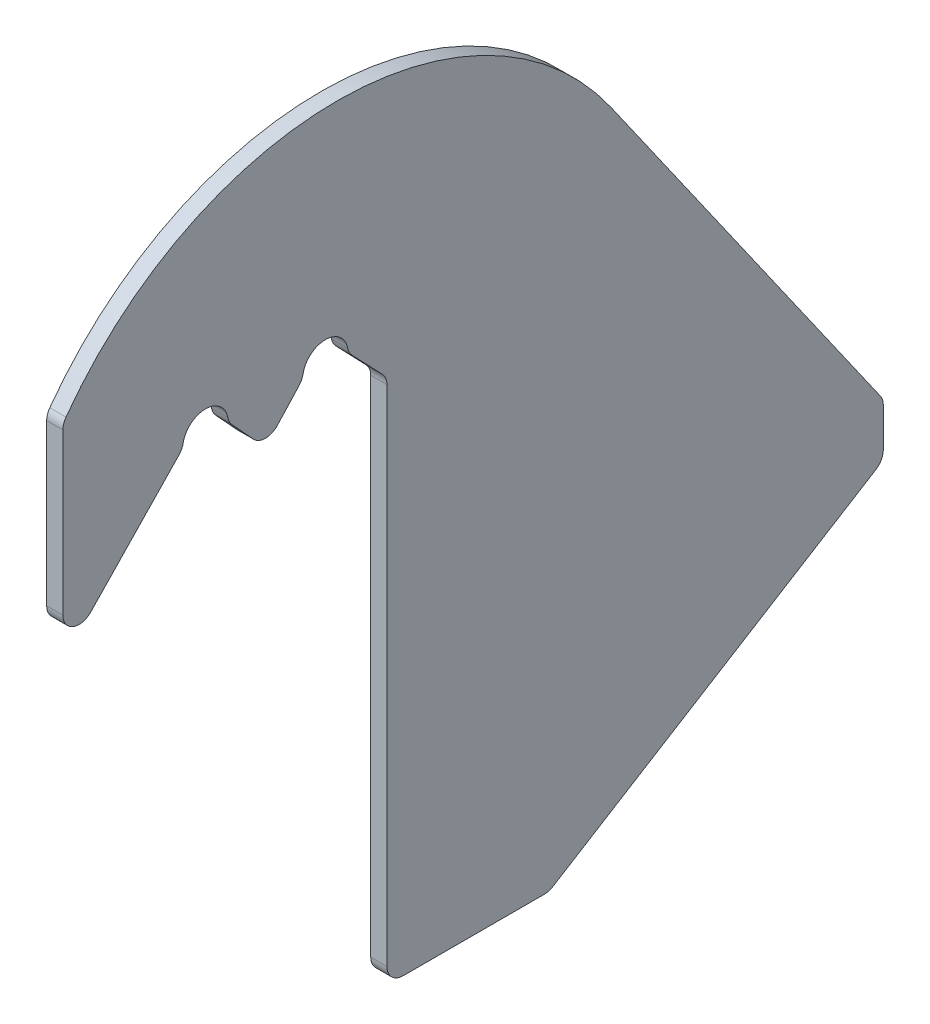
ISO-10303-21;
HEADER;
FILE_DESCRIPTION(('STEP AP214'),'2;1');
FILE_NAME('part.step','',(''),(''),'','','');
FILE_SCHEMA(('AUTOMOTIVE_DESIGN { 1 0 10303 214 1 1 1 1 }'));
ENDSEC;
DATA;
#1=APPLICATION_CONTEXT('core data for automotive mechanical design processes');
#2=APPLICATION_PROTOCOL_DEFINITION('international standard','automotive_design',2000,#1);
#3=PRODUCT_CONTEXT('',#1,'mechanical');
#4=PRODUCT('Part','Part','',(#3));
#5=PRODUCT_RELATED_PRODUCT_CATEGORY('part','',(#4));
#6=PRODUCT_DEFINITION_FORMATION('','',#4);
#7=PRODUCT_DEFINITION_CONTEXT('part definition',#1,'design');
#8=PRODUCT_DEFINITION('design','',#6,#7);
#9=PRODUCT_DEFINITION_SHAPE('','',#8);
#10=(LENGTH_UNIT() NAMED_UNIT(*) SI_UNIT(.MILLI.,.METRE.));
#11=(NAMED_UNIT(*) PLANE_ANGLE_UNIT() SI_UNIT($,.RADIAN.));
#12=(NAMED_UNIT(*) SI_UNIT($,.STERADIAN.) SOLID_ANGLE_UNIT());
#13=UNCERTAINTY_MEASURE_WITH_UNIT(LENGTH_MEASURE(1.E-05),#10,'distance_accuracy_value','');
#14=(GEOMETRIC_REPRESENTATION_CONTEXT(3) GLOBAL_UNCERTAINTY_ASSIGNED_CONTEXT((#13)) GLOBAL_UNIT_ASSIGNED_CONTEXT((#10,
#11,#12)) REPRESENTATION_CONTEXT('',''));
#15=CARTESIAN_POINT('',(0.,0.,0.));
#16=DIRECTION('',(0.,0.,1.));
#17=DIRECTION('',(1.,0.,0.));
#18=AXIS2_PLACEMENT_3D('',#15,#16,#17);
#19=CARTESIAN_POINT('',(2.54,71.5139731788828,33.2327007646322));
#20=DIRECTION('',(-1.,0.,0.));
#21=DIRECTION('',(0.,0.,1.));
#22=AXIS2_PLACEMENT_3D('',#19,#20,#21);
#23=CYLINDRICAL_SURFACE('',#22,52.4533870542467);
#24=CARTESIAN_POINT('',(0.,71.5139731788828,33.2327007646322));
#25=DIRECTION('',(1.,0.,0.));
#26=DIRECTION('',(0.,0.,-1.));
#27=AXIS2_PLACEMENT_3D('',#24,#25,#26);
#28=CIRCLE('',#27,52.4533870542467);
#29=CARTESIAN_POINT('',(0.,101.6,-9.73459847073565));
#30=VERTEX_POINT('',#29);
#31=CARTESIAN_POINT('',(0.,102.277899222594,75.7172705263666));
#32=VERTEX_POINT('',#31);
#33=EDGE_CURVE('E290',#30,#32,#28,.T.);
#34=ORIENTED_EDGE('',*,*,#33,.T.);
#35=DIRECTION('',(-1.,0.,0.));
#36=VECTOR('',#35,1.);
#37=CARTESIAN_POINT('',(2.54,102.277899222594,75.7172705263666));
#38=LINE('',#37,#36);
#39=CARTESIAN_POINT('',(2.54,102.277899222594,75.7172705263666));
#40=VERTEX_POINT('',#39);
#41=EDGE_CURVE('E241',#32,#40,#38,.F.);
#42=ORIENTED_EDGE('',*,*,#41,.T.);
#43=CARTESIAN_POINT('',(2.54,71.5139731788828,33.2327007646322));
#44=DIRECTION('',(1.,0.,0.));
#45=DIRECTION('',(0.,0.,-1.));
#46=AXIS2_PLACEMENT_3D('',#43,#44,#45);
#47=CIRCLE('',#46,52.4533870542467);
#48=CARTESIAN_POINT('',(2.54,101.6,-9.73459847073565));
#49=VERTEX_POINT('',#48);
#50=EDGE_CURVE('E221',#49,#40,#47,.T.);
#51=ORIENTED_EDGE('',*,*,#50,.F.);
#52=DIRECTION('',(-1.,0.,0.));
#53=VECTOR('',#52,1.);
#54=CARTESIAN_POINT('',(2.54,101.6,-9.73459847073565));
#55=LINE('',#54,#53);
#56=EDGE_CURVE('E227',#49,#30,#55,.T.);
#57=ORIENTED_EDGE('',*,*,#56,.T.);
#58=EDGE_LOOP('',(#34,#42,#51,#57));
#59=FACE_BOUND('',#58,.T.);
#60=ADVANCED_FACE('F49',(#59),#23,.T.);
#61=CARTESIAN_POINT('',(2.54,0.,76.2));
#62=DIRECTION('',(0.,0.,-1.));
#63=DIRECTION('',(-1.,0.,0.));
#64=AXIS2_PLACEMENT_3D('',#61,#62,#63);
#65=PLANE('',#64);
#66=DIRECTION('',(0.,-1.,0.));
#67=VECTOR('',#66,1.);
#68=CARTESIAN_POINT('',(2.54,0.,76.2));
#69=LINE('',#68,#67);
#70=CARTESIAN_POINT('',(2.54,100.788188518684,76.2));
#71=VERTEX_POINT('',#70);
#72=CARTESIAN_POINT('',(2.54,75.6343681304962,76.2));
#73=VERTEX_POINT('',#72);
#74=EDGE_CURVE('E243',#71,#73,#69,.T.);
#75=ORIENTED_EDGE('',*,*,#74,.F.);
#76=DIRECTION('',(-1.,0.,0.));
#77=VECTOR('',#76,1.);
#78=CARTESIAN_POINT('',(2.54,100.788188518684,76.2));
#79=LINE('',#78,#77);
#80=CARTESIAN_POINT('',(0.,100.788188518684,76.2));
#81=VERTEX_POINT('',#80);
#82=EDGE_CURVE('E432',#71,#81,#79,.T.);
#83=ORIENTED_EDGE('',*,*,#82,.T.);
#84=DIRECTION('',(0.,-1.,0.));
#85=VECTOR('',#84,1.);
#86=CARTESIAN_POINT('',(0.,0.,76.2));
#87=LINE('',#86,#85);
#88=CARTESIAN_POINT('',(0.,75.6343681304962,76.2));
#89=VERTEX_POINT('',#88);
#90=EDGE_CURVE('E293',#81,#89,#87,.T.);
#91=ORIENTED_EDGE('',*,*,#90,.T.);
#92=DIRECTION('',(-1.,0.,0.));
#93=VECTOR('',#92,1.);
#94=CARTESIAN_POINT('',(2.54,75.6343681304962,76.2));
#95=LINE('',#94,#93);
#96=EDGE_CURVE('E429',#89,#73,#95,.F.);
#97=ORIENTED_EDGE('',*,*,#96,.T.);
#98=EDGE_LOOP('',(#75,#83,#91,#97));
#99=FACE_BOUND('',#98,.T.);
#100=ADVANCED_FACE('F534',(#99),#65,.F.);
#101=CARTESIAN_POINT('',(2.54,71.3145711906743,74.2860116569526));
#102=DIRECTION('',(0.,0.692531828189713,0.721387321030952));
#103=DIRECTION('',(0.,-0.721387321030952,0.692531828189713));
#104=AXIS2_PLACEMENT_3D('',#101,#102,#103);
#105=PLANE('',#104);
#106=DIRECTION('',(0.,0.721387321030952,-0.692531828189713));
#107=VECTOR('',#106,1.);
#108=CARTESIAN_POINT('',(0.,71.3145711906743,74.2860116569526));
#109=LINE('',#108,#107);
#110=CARTESIAN_POINT('',(0.,73.8753372868943,71.8276762045814));
#111=VERTEX_POINT('',#110);
#112=CARTESIAN_POINT('',(0.,88.2733571214442,58.0055771634136));
#113=VERTEX_POINT('',#112);
#114=EDGE_CURVE('E297',#111,#113,#109,.T.);
#115=ORIENTED_EDGE('',*,*,#114,.T.);
#116=DIRECTION('',(-1.,0.,0.));
#117=VECTOR('',#116,1.);
#118=CARTESIAN_POINT('',(2.54,88.2733571214442,58.0055771634136));
#119=LINE('',#118,#117);
#120=CARTESIAN_POINT('',(2.54,88.2733571214442,58.0055771634136));
#121=VERTEX_POINT('',#120);
#122=EDGE_CURVE('E456',#113,#121,#119,.F.);
#123=ORIENTED_EDGE('',*,*,#122,.T.);
#124=DIRECTION('',(0.,0.721387321030952,-0.692531828189713));
#125=VECTOR('',#124,1.);
#126=CARTESIAN_POINT('',(2.54,71.3145711906743,74.2860116569526));
#127=LINE('',#126,#125);
#128=CARTESIAN_POINT('',(2.54,73.8753372868943,71.8276762045814));
#129=VERTEX_POINT('',#128);
#130=EDGE_CURVE('E248',#129,#121,#127,.T.);
#131=ORIENTED_EDGE('',*,*,#130,.F.);
#132=DIRECTION('',(-1.,0.,0.));
#133=VECTOR('',#132,1.);
#134=CARTESIAN_POINT('',(2.54,73.8753372868943,71.8276762045814));
#135=LINE('',#134,#133);
#136=EDGE_CURVE('E452',#129,#111,#135,.T.);
#137=ORIENTED_EDGE('',*,*,#136,.T.);
#138=EDGE_LOOP('',(#115,#123,#131,#137));
#139=FACE_BOUND('',#138,.T.);
#140=ADVANCED_FACE('F539',(#139),#105,.F.);
#141=CARTESIAN_POINT('',(2.54,88.9,53.848));
#142=DIRECTION('',(-1.,0.,0.));
#143=DIRECTION('',(0.,0.,1.));
#144=AXIS2_PLACEMENT_3D('',#141,#142,#143);
#145=CYLINDRICAL_SURFACE('',#144,3.556);
#146=CARTESIAN_POINT('',(0.,88.9,53.848));
#147=DIRECTION('',(1.,0.,0.));
#148=DIRECTION('',(0.,0.,-1.));
#149=AXIS2_PLACEMENT_3D('',#146,#147,#148);
#150=CIRCLE('',#149,3.556);
#151=CARTESIAN_POINT('',(0.,89.5605596462768,57.3421088926521));
#152=VERTEX_POINT('',#151);
#153=CARTESIAN_POINT('',(0.,89.5412526354933,50.3502963165138));
#154=VERTEX_POINT('',#153);
#155=EDGE_CURVE('E301',#152,#154,#150,.F.);
#156=ORIENTED_EDGE('',*,*,#155,.T.);
#157=DIRECTION('',(-1.,0.,0.));
#158=VECTOR('',#157,1.);
#159=CARTESIAN_POINT('',(2.54,89.5412526354933,50.3502963165138));
#160=LINE('',#159,#158);
#161=CARTESIAN_POINT('',(2.54,89.5412526354933,50.3502963165138));
#162=VERTEX_POINT('',#161);
#163=EDGE_CURVE('E449',#154,#162,#160,.F.);
#164=ORIENTED_EDGE('',*,*,#163,.T.);
#165=CARTESIAN_POINT('',(2.54,88.9,53.848));
#166=DIRECTION('',(1.,0.,0.));
#167=DIRECTION('',(0.,0.,-1.));
#168=AXIS2_PLACEMENT_3D('',#165,#166,#167);
#169=CIRCLE('',#168,3.556);
#170=CARTESIAN_POINT('',(2.54,89.5605596462768,57.3421088926521));
#171=VERTEX_POINT('',#170);
#172=EDGE_CURVE('E256',#171,#162,#169,.F.);
#173=ORIENTED_EDGE('',*,*,#172,.F.);
#174=DIRECTION('',(-1.,0.,0.));
#175=VECTOR('',#174,1.);
#176=CARTESIAN_POINT('',(2.54,89.5605596462768,57.3421088926521));
#177=LINE('',#176,#175);
#178=EDGE_CURVE('E445',#171,#152,#177,.T.);
#179=ORIENTED_EDGE('',*,*,#178,.T.);
#180=EDGE_LOOP('',(#156,#164,#173,#179));
#181=FACE_BOUND('',#180,.T.);
#182=ADVANCED_FACE('F754',(#181),#145,.F.);
#183=CARTESIAN_POINT('',(2.54,15.6934142114382,-17.0580589254764));
#184=DIRECTION('',(0.,0.677056530820881,-0.735931011761832));
#185=DIRECTION('',(0.,0.735931011761832,0.677056530820881));
#186=AXIS2_PLACEMENT_3D('',#183,#184,#185);
#187=PLANE('',#186);
#188=DIRECTION('',(0.,-0.735931011761832,-0.677056530820881));
#189=VECTOR('',#188,1.);
#190=CARTESIAN_POINT('',(2.54,15.6934142114382,-17.0580589254764));
#191=LINE('',#190,#189);
#192=CARTESIAN_POINT('',(2.54,88.2795666439893,49.7212013124701));
#193=VERTEX_POINT('',#192);
#194=CARTESIAN_POINT('',(2.54,84.5818095324729,46.3192647698751));
#195=VERTEX_POINT('',#194);
#196=EDGE_CURVE('E260',#193,#195,#191,.T.);
#197=ORIENTED_EDGE('',*,*,#196,.F.);
#198=DIRECTION('',(-1.,0.,0.));
#199=VECTOR('',#198,1.);
#200=CARTESIAN_POINT('',(2.54,88.2795666439893,49.7212013124701));
#201=LINE('',#200,#199);
#202=CARTESIAN_POINT('',(0.,88.2795666439893,49.7212013124701));
#203=VERTEX_POINT('',#202);
#204=EDGE_CURVE('E441',#193,#203,#201,.T.);
#205=ORIENTED_EDGE('',*,*,#204,.T.);
#206=DIRECTION('',(0.,-0.735931011761832,-0.677056530820881));
#207=VECTOR('',#206,1.);
#208=CARTESIAN_POINT('',(0.,15.6934142114382,-17.0580589254764));
#209=LINE('',#208,#207);
#210=CARTESIAN_POINT('',(0.,84.5818095324729,46.3192647698751));
#211=VERTEX_POINT('',#210);
#212=EDGE_CURVE('E305',#203,#211,#209,.T.);
#213=ORIENTED_EDGE('',*,*,#212,.T.);
#214=DIRECTION('',(-1.,0.,0.));
#215=VECTOR('',#214,1.);
#216=CARTESIAN_POINT('',(2.54,84.5818095324729,46.3192647698751));
#217=LINE('',#216,#215);
#218=EDGE_CURVE('E438',#211,#195,#217,.F.);
#219=ORIENTED_EDGE('',*,*,#218,.T.);
#220=EDGE_LOOP('',(#197,#205,#213,#219));
#221=FACE_BOUND('',#220,.T.);
#222=ADVANCED_FACE('F744',(#221),#187,.F.);
#223=CARTESIAN_POINT('',(2.54,59.9893414211436,65.2058058925478));
#224=DIRECTION('',(0.,0.677056530820881,0.735931011761832));
#225=DIRECTION('',(0.,-0.735931011761832,0.677056530820881));
#226=AXIS2_PLACEMENT_3D('',#223,#224,#225);
#227=PLANE('',#226);
#228=DIRECTION('',(0.,0.735931011761832,-0.677056530820881));
#229=VECTOR('',#228,1.);
#230=CARTESIAN_POINT('',(0.,59.9893414211436,65.2058058925478));
#231=LINE('',#230,#229);
#232=CARTESIAN_POINT('',(0.,84.5818095324729,42.580735230125));
#233=VERTEX_POINT('',#232);
#234=CARTESIAN_POINT('',(0.,88.2795666439893,39.1787986875299));
#235=VERTEX_POINT('',#234);
#236=EDGE_CURVE('E309',#233,#235,#231,.T.);
#237=ORIENTED_EDGE('',*,*,#236,.T.);
#238=DIRECTION('',(1.,0.,0.));
#239=VECTOR('',#238,1.);
#240=CARTESIAN_POINT('',(2.54,88.2795666439893,39.1787986875299));
#241=LINE('',#240,#239);
#242=CARTESIAN_POINT('',(2.54,88.2795666439893,39.1787986875299));
#243=VERTEX_POINT('',#242);
#244=EDGE_CURVE('E477',#235,#243,#241,.T.);
#245=ORIENTED_EDGE('',*,*,#244,.T.);
#246=DIRECTION('',(0.,0.735931011761832,-0.677056530820881));
#247=VECTOR('',#246,1.);
#248=CARTESIAN_POINT('',(2.54,59.9893414211436,65.2058058925478));
#249=LINE('',#248,#247);
#250=CARTESIAN_POINT('',(2.54,84.5818095324729,42.580735230125));
#251=VERTEX_POINT('',#250);
#252=EDGE_CURVE('E264',#251,#243,#249,.T.);
#253=ORIENTED_EDGE('',*,*,#252,.F.);
#254=DIRECTION('',(-1.,0.,0.));
#255=VECTOR('',#254,1.);
#256=CARTESIAN_POINT('',(2.54,84.5818095324729,42.580735230125));
#257=LINE('',#256,#255);
#258=EDGE_CURVE('E473',#251,#233,#257,.T.);
#259=ORIENTED_EDGE('',*,*,#258,.T.);
#260=EDGE_LOOP('',(#237,#245,#253,#259));
#261=FACE_BOUND('',#260,.T.);
#262=ADVANCED_FACE('F734',(#261),#227,.F.);
#263=CARTESIAN_POINT('',(2.54,88.9,35.052));
#264=DIRECTION('',(-1.,0.,0.));
#265=DIRECTION('',(0.,0.,1.));
#266=AXIS2_PLACEMENT_3D('',#263,#264,#265);
#267=CYLINDRICAL_SURFACE('',#266,3.55600000000002);
#268=CARTESIAN_POINT('',(0.,88.9,35.052));
#269=DIRECTION('',(1.,0.,0.));
#270=DIRECTION('',(0.,0.,-1.));
#271=AXIS2_PLACEMENT_3D('',#268,#269,#270);
#272=CIRCLE('',#271,3.55600000000002);
#273=CARTESIAN_POINT('',(0.,89.5605596462769,31.5578911073479));
#274=VERTEX_POINT('',#273);
#275=CARTESIAN_POINT('',(0.,89.5412526354934,38.5497036834862));
#276=VERTEX_POINT('',#275);
#277=EDGE_CURVE('E313',#274,#276,#272,.T.);
#278=ORIENTED_EDGE('',*,*,#277,.F.);
#279=DIRECTION('',(-1.,0.,0.));
#280=VECTOR('',#279,1.);
#281=CARTESIAN_POINT('',(2.54,89.5605596462769,31.5578911073479));
#282=LINE('',#281,#280);
#283=CARTESIAN_POINT('',(2.54,89.5605596462769,31.5578911073479));
#284=VERTEX_POINT('',#283);
#285=EDGE_CURVE('E470',#274,#284,#282,.F.);
#286=ORIENTED_EDGE('',*,*,#285,.T.);
#287=CARTESIAN_POINT('',(2.54,88.9,35.052));
#288=DIRECTION('',(1.,0.,0.));
#289=DIRECTION('',(0.,0.,-1.));
#290=AXIS2_PLACEMENT_3D('',#287,#288,#289);
#291=CIRCLE('',#290,3.55600000000002);
#292=CARTESIAN_POINT('',(2.54,89.5412526354934,38.5497036834862));
#293=VERTEX_POINT('',#292);
#294=EDGE_CURVE('E268',#284,#293,#291,.T.);
#295=ORIENTED_EDGE('',*,*,#294,.T.);
#296=DIRECTION('',(-1.,0.,0.));
#297=VECTOR('',#296,1.);
#298=CARTESIAN_POINT('',(2.54,89.5412526354934,38.5497036834862));
#299=LINE('',#298,#297);
#300=EDGE_CURVE('E466',#293,#276,#299,.T.);
#301=ORIENTED_EDGE('',*,*,#300,.T.);
#302=EDGE_LOOP('',(#278,#286,#295,#301));
#303=FACE_BOUND('',#302,.T.);
#304=ADVANCED_FACE('F725',(#303),#267,.F.);
#305=CARTESIAN_POINT('',(2.54,26.9015820149872,-28.0224812656119));
#306=DIRECTION('',(0.,0.692531828189711,-0.721387321030954));
#307=DIRECTION('',(0.,0.721387321030954,0.692531828189711));
#308=AXIS2_PLACEMENT_3D('',#305,#306,#307);
#309=PLANE('',#308);
#310=DIRECTION('',(0.,-0.721387321030954,-0.692531828189711));
#311=VECTOR('',#310,1.);
#312=CARTESIAN_POINT('',(2.54,26.9015820149872,-28.0224812656119));
#313=LINE('',#312,#311);
#314=CARTESIAN_POINT('',(2.54,88.2733571214442,30.8944228365864));
#315=VERTEX_POINT('',#314);
#316=CARTESIAN_POINT('',(2.54,83.2871627131056,26.1076762045814));
#317=VERTEX_POINT('',#316);
#318=EDGE_CURVE('E272',#315,#317,#313,.T.);
#319=ORIENTED_EDGE('',*,*,#318,.F.);
#320=DIRECTION('',(1.,0.,0.));
#321=VECTOR('',#320,1.);
#322=CARTESIAN_POINT('',(0.,88.2733571214442,30.8944228365864));
#323=LINE('',#322,#321);
#324=CARTESIAN_POINT('',(0.,88.2733571214442,30.8944228365864));
#325=VERTEX_POINT('',#324);
#326=EDGE_CURVE('E462',#315,#325,#323,.F.);
#327=ORIENTED_EDGE('',*,*,#326,.T.);
#328=DIRECTION('',(0.,-0.721387321030954,-0.692531828189711));
#329=VECTOR('',#328,1.);
#330=CARTESIAN_POINT('',(0.,26.9015820149872,-28.0224812656119));
#331=LINE('',#330,#329);
#332=CARTESIAN_POINT('',(0.,83.2871627131056,26.1076762045814));
#333=VERTEX_POINT('',#332);
#334=EDGE_CURVE('E317',#325,#333,#331,.T.);
#335=ORIENTED_EDGE('',*,*,#334,.T.);
#336=DIRECTION('',(-1.,0.,0.));
#337=VECTOR('',#336,1.);
#338=CARTESIAN_POINT('',(2.54,83.2871627131056,26.1076762045814));
#339=LINE('',#338,#337);
#340=EDGE_CURVE('E459',#333,#317,#339,.F.);
#341=ORIENTED_EDGE('',*,*,#340,.T.);
#342=EDGE_LOOP('',(#319,#327,#335,#341));
#343=FACE_BOUND('',#342,.T.);
#344=ADVANCED_FACE('F489',(#343),#309,.F.);
#345=CARTESIAN_POINT('',(2.54,0.,25.4));
#346=DIRECTION('',(0.,0.,1.));
#347=DIRECTION('',(0.,-1.,0.));
#348=AXIS2_PLACEMENT_3D('',#345,#346,#347);
#349=PLANE('',#348);
#350=DIRECTION('',(0.,1.,0.));
#351=VECTOR('',#350,1.);
#352=CARTESIAN_POINT('',(0.,0.,25.4));
#353=LINE('',#352,#351);
#354=CARTESIAN_POINT('',(0.,2.53999999999999,25.4));
#355=VERTEX_POINT('',#354);
#356=CARTESIAN_POINT('',(0.,81.5281318695037,25.4));
#357=VERTEX_POINT('',#356);
#358=EDGE_CURVE('E321',#355,#357,#353,.T.);
#359=ORIENTED_EDGE('',*,*,#358,.F.);
#360=DIRECTION('',(-1.,0.,0.));
#361=VECTOR('',#360,1.);
#362=CARTESIAN_POINT('',(2.54,2.53999999999999,25.4));
#363=LINE('',#362,#361);
#364=CARTESIAN_POINT('',(2.54,2.53999999999999,25.4));
#365=VERTEX_POINT('',#364);
#366=EDGE_CURVE('E378',#355,#365,#363,.F.);
#367=ORIENTED_EDGE('',*,*,#366,.T.);
#368=DIRECTION('',(0.,1.,0.));
#369=VECTOR('',#368,1.);
#370=CARTESIAN_POINT('',(2.54,0.,25.4));
#371=LINE('',#370,#369);
#372=CARTESIAN_POINT('',(2.54,81.5281318695037,25.4));
#373=VERTEX_POINT('',#372);
#374=EDGE_CURVE('E276',#365,#373,#371,.T.);
#375=ORIENTED_EDGE('',*,*,#374,.T.);
#376=DIRECTION('',(-1.,0.,0.));
#377=VECTOR('',#376,1.);
#378=CARTESIAN_POINT('',(2.54,81.5281318695037,25.4));
#379=LINE('',#378,#377);
#380=EDGE_CURVE('E374',#373,#357,#379,.T.);
#381=ORIENTED_EDGE('',*,*,#380,.T.);
#382=EDGE_LOOP('',(#359,#367,#375,#381));
#383=FACE_BOUND('',#382,.T.);
#384=ADVANCED_FACE('F495',(#383),#349,.T.);
#385=CARTESIAN_POINT('',(2.54,0.,0.));
#386=DIRECTION('',(0.,-1.,0.));
#387=DIRECTION('',(0.,0.,-1.));
#388=AXIS2_PLACEMENT_3D('',#385,#386,#387);
#389=PLANE('',#388);
#390=DIRECTION('',(0.,0.,1.));
#391=VECTOR('',#390,1.);
#392=CARTESIAN_POINT('',(2.54,0.,0.));
#393=LINE('',#392,#391);
#394=CARTESIAN_POINT('',(2.54,0.,0.721335708247373));
#395=VERTEX_POINT('',#394);
#396=CARTESIAN_POINT('',(2.54,0.,22.86));
#397=VERTEX_POINT('',#396);
#398=EDGE_CURVE('E280',#395,#397,#393,.T.);
#399=ORIENTED_EDGE('',*,*,#398,.T.);
#400=DIRECTION('',(-1.,0.,0.));
#401=VECTOR('',#400,1.);
#402=CARTESIAN_POINT('',(2.54,0.,22.86));
#403=LINE('',#402,#401);
#404=CARTESIAN_POINT('',(0.,0.,22.86));
#405=VERTEX_POINT('',#404);
#406=EDGE_CURVE('E337',#397,#405,#403,.T.);
#407=ORIENTED_EDGE('',*,*,#406,.T.);
#408=DIRECTION('',(0.,0.,1.));
#409=VECTOR('',#408,1.);
#410=CARTESIAN_POINT('',(0.,0.,0.));
#411=LINE('',#410,#409);
#412=CARTESIAN_POINT('',(0.,0.,0.721335708247373));
#413=VERTEX_POINT('',#412);
#414=EDGE_CURVE('E325',#413,#405,#411,.T.);
#415=ORIENTED_EDGE('',*,*,#414,.F.);
#416=DIRECTION('',(-1.,0.,0.));
#417=VECTOR('',#416,1.);
#418=CARTESIAN_POINT('',(2.54,0.,0.721335708247373));
#419=LINE('',#418,#417);
#420=EDGE_CURVE('E238',#413,#395,#419,.F.);
#421=ORIENTED_EDGE('',*,*,#420,.T.);
#422=EDGE_LOOP('',(#399,#407,#415,#421));
#423=FACE_BOUND('',#422,.T.);
#424=ADVANCED_FACE('F503',(#423),#389,.T.);
#425=CARTESIAN_POINT('',(2.54,0.,0.));
#426=DIRECTION('',(0.,-0.850737009142106,-0.525591610735886));
#427=DIRECTION('',(0.,0.525591610735887,-0.850737009142106));
#428=AXIS2_PLACEMENT_3D('',#425,#426,#427);
#429=PLANE('',#428);
#430=DIRECTION('',(0.,-0.525591610735887,0.850737009142106));
#431=VECTOR('',#430,1.);
#432=CARTESIAN_POINT('',(2.54,0.,0.));
#433=LINE('',#432,#431);
#434=CARTESIAN_POINT('',(2.54,31.6405437583856,-51.2142526912692));
#435=VERTEX_POINT('',#434);
#436=CARTESIAN_POINT('',(2.54,0.379127996779051,-0.613666983021778));
#437=VERTEX_POINT('',#436);
#438=EDGE_CURVE('E284',#435,#437,#433,.T.);
#439=ORIENTED_EDGE('',*,*,#438,.T.);
#440=DIRECTION('',(-1.,0.,0.));
#441=VECTOR('',#440,1.);
#442=CARTESIAN_POINT('',(2.54,0.379127996779051,-0.613666983021777));
#443=LINE('',#442,#441);
#444=CARTESIAN_POINT('',(0.,0.379127996779051,-0.613666983021778));
#445=VERTEX_POINT('',#444);
#446=EDGE_CURVE('E416',#437,#445,#443,.T.);
#447=ORIENTED_EDGE('',*,*,#446,.T.);
#448=DIRECTION('',(0.,-0.525591610735887,0.850737009142106));
#449=VECTOR('',#448,1.);
#450=CARTESIAN_POINT('',(0.,0.,0.));
#451=LINE('',#450,#449);
#452=CARTESIAN_POINT('',(0.,31.6405437583856,-51.2142526912692));
#453=VERTEX_POINT('',#452);
#454=EDGE_CURVE('E329',#453,#445,#451,.T.);
#455=ORIENTED_EDGE('',*,*,#454,.F.);
#456=DIRECTION('',(-1.,0.,0.));
#457=VECTOR('',#456,1.);
#458=CARTESIAN_POINT('',(2.54,31.6405437583855,-51.2142526912691));
#459=LINE('',#458,#457);
#460=EDGE_CURVE('E413',#453,#435,#459,.F.);
#461=ORIENTED_EDGE('',*,*,#460,.T.);
#462=EDGE_LOOP('',(#439,#447,#455,#461));
#463=FACE_BOUND('',#462,.T.);
#464=ADVANCED_FACE('F512',(#463),#429,.T.);
#465=CARTESIAN_POINT('',(2.54,0.,-52.41925));
#466=DIRECTION('',(0.,0.,1.));
#467=DIRECTION('',(1.,0.,0.));
#468=AXIS2_PLACEMENT_3D('',#465,#466,#467);
#469=PLANE('',#468);
#470=DIRECTION('',(0.,1.,0.));
#471=VECTOR('',#470,1.);
#472=CARTESIAN_POINT('',(2.54,0.,-52.41925));
#473=LINE('',#472,#471);
#474=CARTESIAN_POINT('',(2.54,33.8014157616065,-52.41925));
#475=VERTEX_POINT('',#474);
#476=CARTESIAN_POINT('',(2.54,39.8391410762474,-52.41925));
#477=VERTEX_POINT('',#476);
#478=EDGE_CURVE('E228',#475,#477,#473,.T.);
#479=ORIENTED_EDGE('',*,*,#478,.F.);
#480=DIRECTION('',(-1.,0.,0.));
#481=VECTOR('',#480,1.);
#482=CARTESIAN_POINT('',(0.,33.8014157616065,-52.41925));
#483=LINE('',#482,#481);
#484=CARTESIAN_POINT('',(0.,33.8014157616065,-52.41925));
#485=VERTEX_POINT('',#484);
#486=EDGE_CURVE('E422',#475,#485,#483,.T.);
#487=ORIENTED_EDGE('',*,*,#486,.T.);
#488=DIRECTION('',(0.,1.,0.));
#489=VECTOR('',#488,1.);
#490=CARTESIAN_POINT('',(0.,0.,-52.41925));
#491=LINE('',#490,#489);
#492=CARTESIAN_POINT('',(0.,39.8391410762474,-52.41925));
#493=VERTEX_POINT('',#492);
#494=EDGE_CURVE('E250',#485,#493,#491,.T.);
#495=ORIENTED_EDGE('',*,*,#494,.T.);
#496=DIRECTION('',(-1.,0.,0.));
#497=VECTOR('',#496,1.);
#498=CARTESIAN_POINT('',(2.54,39.8391410762474,-52.41925));
#499=LINE('',#498,#497);
#500=EDGE_CURVE('E73',#493,#477,#499,.F.);
#501=ORIENTED_EDGE('',*,*,#500,.T.);
#502=EDGE_LOOP('',(#479,#487,#495,#501));
#503=FACE_BOUND('',#502,.T.);
#504=ADVANCED_FACE('F518',(#503),#469,.F.);
#505=CARTESIAN_POINT('',(2.54,37.9991418936885,-54.2683987533815));
#506=DIRECTION('',(0.,-0.57357643635105,0.819152044288989));
#507=DIRECTION('',(0.,-0.819152044288989,-0.57357643635105));
#508=AXIS2_PLACEMENT_3D('',#505,#506,#507);
#509=PLANE('',#508);
#510=DIRECTION('',(0.,0.819152044288989,0.57357643635105));
#511=VECTOR('',#510,1.);
#512=CARTESIAN_POINT('',(2.54,37.9991418936885,-54.2683987533815));
#513=LINE('',#512,#511);
#514=CARTESIAN_POINT('',(2.54,41.296025224579,-51.959896192494));
#515=VERTEX_POINT('',#514);
#516=EDGE_CURVE('E216',#515,#49,#513,.T.);
#517=ORIENTED_EDGE('',*,*,#516,.F.);
#518=DIRECTION('',(-1.,0.,0.));
#519=VECTOR('',#518,1.);
#520=CARTESIAN_POINT('',(2.54,41.296025224579,-51.959896192494));
#521=LINE('',#520,#519);
#522=CARTESIAN_POINT('',(0.,41.296025224579,-51.959896192494));
#523=VERTEX_POINT('',#522);
#524=EDGE_CURVE('E426',#515,#523,#521,.T.);
#525=ORIENTED_EDGE('',*,*,#524,.T.);
#526=DIRECTION('',(0.,0.819152044288989,0.57357643635105));
#527=VECTOR('',#526,1.);
#528=CARTESIAN_POINT('',(0.,37.9991418936885,-54.2683987533815));
#529=LINE('',#528,#527);
#530=EDGE_CURVE('E233',#523,#30,#529,.T.);
#531=ORIENTED_EDGE('',*,*,#530,.T.);
#532=ORIENTED_EDGE('',*,*,#56,.F.);
#533=EDGE_LOOP('',(#517,#525,#531,#532));
#534=FACE_BOUND('',#533,.T.);
#535=ADVANCED_FACE('F231',(#534),#509,.F.);
#536=CARTESIAN_POINT('',(2.54,0.,0.));
#537=DIRECTION('',(1.,0.,0.));
#538=DIRECTION('',(0.,0.,-1.));
#539=AXIS2_PLACEMENT_3D('',#536,#537,#538);
#540=PLANE('',#539);
#541=ORIENTED_EDGE('',*,*,#374,.F.);
#542=CARTESIAN_POINT('',(2.54,2.54,22.86));
#543=DIRECTION('',(1.,0.,0.));
#544=DIRECTION('',(0.,0.,-1.));
#545=AXIS2_PLACEMENT_3D('',#542,#543,#544);
#546=CIRCLE('',#545,2.54);
#547=EDGE_CURVE('E410',#365,#397,#546,.T.);
#548=ORIENTED_EDGE('',*,*,#547,.T.);
#549=ORIENTED_EDGE('',*,*,#398,.F.);
#550=CARTESIAN_POINT('',(2.54,2.54,0.721335708247374));
#551=DIRECTION('',(1.,0.,0.));
#552=DIRECTION('',(0.,0.,-1.));
#553=AXIS2_PLACEMENT_3D('',#550,#551,#552);
#554=CIRCLE('',#553,2.54);
#555=EDGE_CURVE('E407',#395,#437,#554,.T.);
#556=ORIENTED_EDGE('',*,*,#555,.T.);
#557=ORIENTED_EDGE('',*,*,#438,.F.);
#558=CARTESIAN_POINT('',(2.54,33.8014157616065,-49.87925));
#559=DIRECTION('',(1.,0.,0.));
#560=DIRECTION('',(0.,0.,-1.));
#561=AXIS2_PLACEMENT_3D('',#558,#559,#560);
#562=CIRCLE('',#561,2.54);
#563=EDGE_CURVE('E404',#435,#475,#562,.T.);
#564=ORIENTED_EDGE('',*,*,#563,.T.);
#565=ORIENTED_EDGE('',*,*,#478,.T.);
#566=CARTESIAN_POINT('',(2.54,39.8391410762474,-49.87925));
#567=DIRECTION('',(1.,0.,0.));
#568=DIRECTION('',(0.,0.,-1.));
#569=AXIS2_PLACEMENT_3D('',#566,#567,#568);
#570=CIRCLE('',#569,2.54);
#571=EDGE_CURVE('E65',#477,#515,#570,.T.);
#572=ORIENTED_EDGE('',*,*,#571,.T.);
#573=ORIENTED_EDGE('',*,*,#516,.T.);
#574=ORIENTED_EDGE('',*,*,#50,.T.);
#575=CARTESIAN_POINT('',(2.54,100.788188518684,73.66));
#576=DIRECTION('',(1.,0.,0.));
#577=DIRECTION('',(0.,0.,-1.));
#578=AXIS2_PLACEMENT_3D('',#575,#576,#577);
#579=CIRCLE('',#578,2.54);
#580=EDGE_CURVE('E399',#40,#71,#579,.T.);
#581=ORIENTED_EDGE('',*,*,#580,.T.);
#582=ORIENTED_EDGE('',*,*,#74,.T.);
#583=CARTESIAN_POINT('',(2.54,75.6343681304962,73.66));
#584=DIRECTION('',(1.,0.,0.));
#585=DIRECTION('',(0.,0.,-1.));
#586=AXIS2_PLACEMENT_3D('',#583,#584,#585);
#587=CIRCLE('',#586,2.54);
#588=EDGE_CURVE('E381',#73,#129,#587,.T.);
#589=ORIENTED_EDGE('',*,*,#588,.T.);
#590=ORIENTED_EDGE('',*,*,#130,.T.);
#591=CARTESIAN_POINT('',(2.54,90.032387965046,59.8379009588322));
#592=DIRECTION('',(1.,0.,0.));
#593=DIRECTION('',(0.,0.,-1.));
#594=AXIS2_PLACEMENT_3D('',#591,#592,#593);
#595=CIRCLE('',#594,2.54);
#596=EDGE_CURVE('E393',#121,#171,#595,.T.);
#597=ORIENTED_EDGE('',*,*,#596,.T.);
#598=ORIENTED_EDGE('',*,*,#172,.T.);
#599=CARTESIAN_POINT('',(2.54,89.9992902322743,47.8519365425951));
#600=DIRECTION('',(1.,0.,0.));
#601=DIRECTION('',(0.,0.,-1.));
#602=AXIS2_PLACEMENT_3D('',#599,#600,#601);
#603=CIRCLE('',#602,2.54);
#604=EDGE_CURVE('E396',#162,#193,#603,.T.);
#605=ORIENTED_EDGE('',*,*,#604,.T.);
#606=ORIENTED_EDGE('',*,*,#196,.T.);
#607=CARTESIAN_POINT('',(2.54,86.3015331207579,44.45));
#608=DIRECTION('',(1.,0.,0.));
#609=DIRECTION('',(0.,0.,-1.));
#610=AXIS2_PLACEMENT_3D('',#607,#608,#609);
#611=CIRCLE('',#610,2.54);
#612=EDGE_CURVE('E384',#195,#251,#611,.T.);
#613=ORIENTED_EDGE('',*,*,#612,.T.);
#614=ORIENTED_EDGE('',*,*,#252,.T.);
#615=CARTESIAN_POINT('',(2.54,89.9992902322743,41.0480634574049));
#616=DIRECTION('',(1.,0.,0.));
#617=DIRECTION('',(0.,0.,-1.));
#618=AXIS2_PLACEMENT_3D('',#615,#616,#617);
#619=CIRCLE('',#618,2.54);
#620=EDGE_CURVE('E387',#243,#293,#619,.T.);
#621=ORIENTED_EDGE('',*,*,#620,.T.);
#622=ORIENTED_EDGE('',*,*,#294,.F.);
#623=CARTESIAN_POINT('',(2.54,90.0323879650461,29.0620990411678));
#624=DIRECTION('',(1.,0.,0.));
#625=DIRECTION('',(0.,0.,-1.));
#626=AXIS2_PLACEMENT_3D('',#623,#624,#625);
#627=CIRCLE('',#626,2.54);
#628=EDGE_CURVE('E390',#284,#315,#627,.T.);
#629=ORIENTED_EDGE('',*,*,#628,.T.);
#630=ORIENTED_EDGE('',*,*,#318,.T.);
#631=CARTESIAN_POINT('',(2.54,81.5281318695037,27.94));
#632=DIRECTION('',(1.,0.,0.));
#633=DIRECTION('',(0.,0.,-1.));
#634=AXIS2_PLACEMENT_3D('',#631,#632,#633);
#635=CIRCLE('',#634,2.54);
#636=EDGE_CURVE('E11',#317,#373,#635,.F.);
#637=ORIENTED_EDGE('',*,*,#636,.T.);
#638=EDGE_LOOP('',(#541,#548,#549,#556,#557,#564,#565,#572,#573,#574,#581,#582,#589,#590,#597,
#598,#605,#606,#613,#614,#621,#622,#629,#630,#637));
#639=FACE_BOUND('',#638,.T.);
#640=ADVANCED_FACE('F219',(#639),#540,.T.);
#641=CARTESIAN_POINT('',(0.,0.,0.));
#642=DIRECTION('',(1.,0.,0.));
#643=DIRECTION('',(0.,0.,-1.));
#644=AXIS2_PLACEMENT_3D('',#641,#642,#643);
#645=PLANE('',#644);
#646=ORIENTED_EDGE('',*,*,#414,.T.);
#647=CARTESIAN_POINT('',(0.,2.54,22.86));
#648=DIRECTION('',(1.,0.,0.));
#649=DIRECTION('',(0.,0.,-1.));
#650=AXIS2_PLACEMENT_3D('',#647,#648,#649);
#651=CIRCLE('',#650,2.54);
#652=EDGE_CURVE('E371',#405,#355,#651,.F.);
#653=ORIENTED_EDGE('',*,*,#652,.T.);
#654=ORIENTED_EDGE('',*,*,#358,.T.);
#655=CARTESIAN_POINT('',(0.,81.5281318695037,27.94));
#656=DIRECTION('',(1.,0.,0.));
#657=DIRECTION('',(0.,0.,-1.));
#658=AXIS2_PLACEMENT_3D('',#655,#656,#657);
#659=CIRCLE('',#658,2.54);
#660=EDGE_CURVE('E58',#357,#333,#659,.T.);
#661=ORIENTED_EDGE('',*,*,#660,.T.);
#662=ORIENTED_EDGE('',*,*,#334,.F.);
#663=CARTESIAN_POINT('',(0.,90.0323879650461,29.0620990411678));
#664=DIRECTION('',(1.,0.,0.));
#665=DIRECTION('',(0.,0.,-1.));
#666=AXIS2_PLACEMENT_3D('',#663,#664,#665);
#667=CIRCLE('',#666,2.54);
#668=EDGE_CURVE('E350',#325,#274,#667,.F.);
#669=ORIENTED_EDGE('',*,*,#668,.T.);
#670=ORIENTED_EDGE('',*,*,#277,.T.);
#671=CARTESIAN_POINT('',(0.,89.9992902322743,41.0480634574049));
#672=DIRECTION('',(1.,0.,0.));
#673=DIRECTION('',(0.,0.,-1.));
#674=AXIS2_PLACEMENT_3D('',#671,#672,#673);
#675=CIRCLE('',#674,2.54);
#676=EDGE_CURVE('E347',#276,#235,#675,.F.);
#677=ORIENTED_EDGE('',*,*,#676,.T.);
#678=ORIENTED_EDGE('',*,*,#236,.F.);
#679=CARTESIAN_POINT('',(0.,86.3015331207579,44.45));
#680=DIRECTION('',(1.,0.,0.));
#681=DIRECTION('',(0.,0.,-1.));
#682=AXIS2_PLACEMENT_3D('',#679,#680,#681);
#683=CIRCLE('',#682,2.54);
#684=EDGE_CURVE('E344',#233,#211,#683,.F.);
#685=ORIENTED_EDGE('',*,*,#684,.T.);
#686=ORIENTED_EDGE('',*,*,#212,.F.);
#687=CARTESIAN_POINT('',(0.,89.9992902322743,47.8519365425951));
#688=DIRECTION('',(1.,0.,0.));
#689=DIRECTION('',(0.,0.,-1.));
#690=AXIS2_PLACEMENT_3D('',#687,#688,#689);
#691=CIRCLE('',#690,2.54);
#692=EDGE_CURVE('E356',#203,#154,#691,.F.);
#693=ORIENTED_EDGE('',*,*,#692,.T.);
#694=ORIENTED_EDGE('',*,*,#155,.F.);
#695=CARTESIAN_POINT('',(0.,90.032387965046,59.8379009588322));
#696=DIRECTION('',(1.,0.,0.));
#697=DIRECTION('',(0.,0.,-1.));
#698=AXIS2_PLACEMENT_3D('',#695,#696,#697);
#699=CIRCLE('',#698,2.54);
#700=EDGE_CURVE('E353',#152,#113,#699,.F.);
#701=ORIENTED_EDGE('',*,*,#700,.T.);
#702=ORIENTED_EDGE('',*,*,#114,.F.);
#703=CARTESIAN_POINT('',(0.,75.6343681304962,73.66));
#704=DIRECTION('',(1.,0.,0.));
#705=DIRECTION('',(0.,0.,-1.));
#706=AXIS2_PLACEMENT_3D('',#703,#704,#705);
#707=CIRCLE('',#706,2.54);
#708=EDGE_CURVE('E341',#111,#89,#707,.F.);
#709=ORIENTED_EDGE('',*,*,#708,.T.);
#710=ORIENTED_EDGE('',*,*,#90,.F.);
#711=CARTESIAN_POINT('',(0.,100.788188518684,73.66));
#712=DIRECTION('',(1.,0.,0.));
#713=DIRECTION('',(0.,0.,-1.));
#714=AXIS2_PLACEMENT_3D('',#711,#712,#713);
#715=CIRCLE('',#714,2.54);
#716=EDGE_CURVE('E359',#81,#32,#715,.F.);
#717=ORIENTED_EDGE('',*,*,#716,.T.);
#718=ORIENTED_EDGE('',*,*,#33,.F.);
#719=ORIENTED_EDGE('',*,*,#530,.F.);
#720=CARTESIAN_POINT('',(0.,39.8391410762474,-49.87925));
#721=DIRECTION('',(1.,0.,0.));
#722=DIRECTION('',(0.,0.,-1.));
#723=AXIS2_PLACEMENT_3D('',#720,#721,#722);
#724=CIRCLE('',#723,2.54);
#725=EDGE_CURVE('E362',#523,#493,#724,.F.);
#726=ORIENTED_EDGE('',*,*,#725,.T.);
#727=ORIENTED_EDGE('',*,*,#494,.F.);
#728=CARTESIAN_POINT('',(0.,33.8014157616065,-49.87925));
#729=DIRECTION('',(1.,0.,0.));
#730=DIRECTION('',(0.,0.,-1.));
#731=AXIS2_PLACEMENT_3D('',#728,#729,#730);
#732=CIRCLE('',#731,2.54);
#733=EDGE_CURVE('E365',#485,#453,#732,.F.);
#734=ORIENTED_EDGE('',*,*,#733,.T.);
#735=ORIENTED_EDGE('',*,*,#454,.T.);
#736=CARTESIAN_POINT('',(0.,2.54,0.721335708247374));
#737=DIRECTION('',(1.,0.,0.));
#738=DIRECTION('',(0.,0.,-1.));
#739=AXIS2_PLACEMENT_3D('',#736,#737,#738);
#740=CIRCLE('',#739,2.54);
#741=EDGE_CURVE('E368',#445,#413,#740,.F.);
#742=ORIENTED_EDGE('',*,*,#741,.T.);
#743=EDGE_LOOP('',(#646,#653,#654,#661,#662,#669,#670,#677,#678,#685,#686,#693,#694,#701,#702,
#709,#710,#717,#718,#719,#726,#727,#734,#735,#742));
#744=FACE_BOUND('',#743,.T.);
#745=ADVANCED_FACE('F482',(#744),#645,.F.);
#746=CARTESIAN_POINT('',(2.54,2.54,22.86));
#747=DIRECTION('',(-1.,0.,0.));
#748=DIRECTION('',(0.,0.,1.));
#749=AXIS2_PLACEMENT_3D('',#746,#747,#748);
#750=CYLINDRICAL_SURFACE('',#749,2.54);
#751=ORIENTED_EDGE('',*,*,#547,.F.);
#752=ORIENTED_EDGE('',*,*,#366,.F.);
#753=ORIENTED_EDGE('',*,*,#652,.F.);
#754=ORIENTED_EDGE('',*,*,#406,.F.);
#755=EDGE_LOOP('',(#751,#752,#753,#754));
#756=FACE_BOUND('',#755,.T.);
#757=ADVANCED_FACE('F498',(#756),#750,.T.);
#758=CARTESIAN_POINT('',(2.54,2.54,0.721335708247374));
#759=DIRECTION('',(-1.,0.,0.));
#760=DIRECTION('',(0.,0.,1.));
#761=AXIS2_PLACEMENT_3D('',#758,#759,#760);
#762=CYLINDRICAL_SURFACE('',#761,2.54);
#763=ORIENTED_EDGE('',*,*,#555,.F.);
#764=ORIENTED_EDGE('',*,*,#420,.F.);
#765=ORIENTED_EDGE('',*,*,#741,.F.);
#766=ORIENTED_EDGE('',*,*,#446,.F.);
#767=EDGE_LOOP('',(#763,#764,#765,#766));
#768=FACE_BOUND('',#767,.T.);
#769=ADVANCED_FACE('F507',(#768),#762,.T.);
#770=CARTESIAN_POINT('',(2.54,33.8014157616065,-49.87925));
#771=DIRECTION('',(1.,0.,0.));
#772=DIRECTION('',(0.,0.,-1.));
#773=AXIS2_PLACEMENT_3D('',#770,#771,#772);
#774=CYLINDRICAL_SURFACE('',#773,2.54);
#775=ORIENTED_EDGE('',*,*,#563,.F.);
#776=ORIENTED_EDGE('',*,*,#460,.F.);
#777=ORIENTED_EDGE('',*,*,#733,.F.);
#778=ORIENTED_EDGE('',*,*,#486,.F.);
#779=EDGE_LOOP('',(#775,#776,#777,#778));
#780=FACE_BOUND('',#779,.T.);
#781=ADVANCED_FACE('F516',(#780),#774,.T.);
#782=CARTESIAN_POINT('',(2.54,39.8391410762474,-49.87925));
#783=DIRECTION('',(-1.,0.,0.));
#784=DIRECTION('',(0.,0.,1.));
#785=AXIS2_PLACEMENT_3D('',#782,#783,#784);
#786=CYLINDRICAL_SURFACE('',#785,2.54);
#787=ORIENTED_EDGE('',*,*,#571,.F.);
#788=ORIENTED_EDGE('',*,*,#500,.F.);
#789=ORIENTED_EDGE('',*,*,#725,.F.);
#790=ORIENTED_EDGE('',*,*,#524,.F.);
#791=EDGE_LOOP('',(#787,#788,#789,#790));
#792=FACE_BOUND('',#791,.T.);
#793=ADVANCED_FACE('F521',(#792),#786,.T.);
#794=CARTESIAN_POINT('',(2.54,100.788188518684,73.66));
#795=DIRECTION('',(-1.,0.,0.));
#796=DIRECTION('',(0.,0.,1.));
#797=AXIS2_PLACEMENT_3D('',#794,#795,#796);
#798=CYLINDRICAL_SURFACE('',#797,2.54);
#799=ORIENTED_EDGE('',*,*,#580,.F.);
#800=ORIENTED_EDGE('',*,*,#41,.F.);
#801=ORIENTED_EDGE('',*,*,#716,.F.);
#802=ORIENTED_EDGE('',*,*,#82,.F.);
#803=EDGE_LOOP('',(#799,#800,#801,#802));
#804=FACE_BOUND('',#803,.T.);
#805=ADVANCED_FACE('F523',(#804),#798,.T.);
#806=CARTESIAN_POINT('',(2.54,89.9992902322743,47.8519365425951));
#807=DIRECTION('',(-1.,0.,0.));
#808=DIRECTION('',(0.,0.,1.));
#809=AXIS2_PLACEMENT_3D('',#806,#807,#808);
#810=CYLINDRICAL_SURFACE('',#809,2.54);
#811=ORIENTED_EDGE('',*,*,#604,.F.);
#812=ORIENTED_EDGE('',*,*,#163,.F.);
#813=ORIENTED_EDGE('',*,*,#692,.F.);
#814=ORIENTED_EDGE('',*,*,#204,.F.);
#815=EDGE_LOOP('',(#811,#812,#813,#814));
#816=FACE_BOUND('',#815,.T.);
#817=ADVANCED_FACE('F529',(#816),#810,.T.);
#818=CARTESIAN_POINT('',(2.54,90.032387965046,59.8379009588322));
#819=DIRECTION('',(-1.,0.,0.));
#820=DIRECTION('',(0.,0.,1.));
#821=AXIS2_PLACEMENT_3D('',#818,#819,#820);
#822=CYLINDRICAL_SURFACE('',#821,2.54);
#823=ORIENTED_EDGE('',*,*,#596,.F.);
#824=ORIENTED_EDGE('',*,*,#122,.F.);
#825=ORIENTED_EDGE('',*,*,#700,.F.);
#826=ORIENTED_EDGE('',*,*,#178,.F.);
#827=EDGE_LOOP('',(#823,#824,#825,#826));
#828=FACE_BOUND('',#827,.T.);
#829=ADVANCED_FACE('F578',(#828),#822,.T.);
#830=CARTESIAN_POINT('',(2.54,90.0323879650461,29.0620990411678));
#831=DIRECTION('',(-1.,0.,0.));
#832=DIRECTION('',(0.,0.,1.));
#833=AXIS2_PLACEMENT_3D('',#830,#831,#832);
#834=CYLINDRICAL_SURFACE('',#833,2.54);
#835=ORIENTED_EDGE('',*,*,#628,.F.);
#836=ORIENTED_EDGE('',*,*,#285,.F.);
#837=ORIENTED_EDGE('',*,*,#668,.F.);
#838=ORIENTED_EDGE('',*,*,#326,.F.);
#839=EDGE_LOOP('',(#835,#836,#837,#838));
#840=FACE_BOUND('',#839,.T.);
#841=ADVANCED_FACE('F589',(#840),#834,.T.);
#842=CARTESIAN_POINT('',(2.54,89.9992902322743,41.0480634574049));
#843=DIRECTION('',(-1.,0.,0.));
#844=DIRECTION('',(0.,0.,1.));
#845=AXIS2_PLACEMENT_3D('',#842,#843,#844);
#846=CYLINDRICAL_SURFACE('',#845,2.54);
#847=ORIENTED_EDGE('',*,*,#620,.F.);
#848=ORIENTED_EDGE('',*,*,#244,.F.);
#849=ORIENTED_EDGE('',*,*,#676,.F.);
#850=ORIENTED_EDGE('',*,*,#300,.F.);
#851=EDGE_LOOP('',(#847,#848,#849,#850));
#852=FACE_BOUND('',#851,.T.);
#853=ADVANCED_FACE('F600',(#852),#846,.T.);
#854=CARTESIAN_POINT('',(2.54,81.5281318695037,27.94));
#855=DIRECTION('',(-1.,0.,0.));
#856=DIRECTION('',(0.,0.,1.));
#857=AXIS2_PLACEMENT_3D('',#854,#855,#856);
#858=CYLINDRICAL_SURFACE('',#857,2.54);
#859=ORIENTED_EDGE('',*,*,#636,.F.);
#860=ORIENTED_EDGE('',*,*,#340,.F.);
#861=ORIENTED_EDGE('',*,*,#660,.F.);
#862=ORIENTED_EDGE('',*,*,#380,.F.);
#863=EDGE_LOOP('',(#859,#860,#861,#862));
#864=FACE_BOUND('',#863,.T.);
#865=ADVANCED_FACE('F492',(#864),#858,.F.);
#866=CARTESIAN_POINT('',(2.54,86.3015331207579,44.45));
#867=DIRECTION('',(-1.,0.,0.));
#868=DIRECTION('',(0.,0.,1.));
#869=AXIS2_PLACEMENT_3D('',#866,#867,#868);
#870=CYLINDRICAL_SURFACE('',#869,2.54);
#871=ORIENTED_EDGE('',*,*,#612,.F.);
#872=ORIENTED_EDGE('',*,*,#218,.F.);
#873=ORIENTED_EDGE('',*,*,#684,.F.);
#874=ORIENTED_EDGE('',*,*,#258,.F.);
#875=EDGE_LOOP('',(#871,#872,#873,#874));
#876=FACE_BOUND('',#875,.T.);
#877=ADVANCED_FACE('F621',(#876),#870,.T.);
#878=CARTESIAN_POINT('',(2.54,75.6343681304962,73.66));
#879=DIRECTION('',(-1.,0.,0.));
#880=DIRECTION('',(0.,0.,1.));
#881=AXIS2_PLACEMENT_3D('',#878,#879,#880);
#882=CYLINDRICAL_SURFACE('',#881,2.54);
#883=ORIENTED_EDGE('',*,*,#588,.F.);
#884=ORIENTED_EDGE('',*,*,#96,.F.);
#885=ORIENTED_EDGE('',*,*,#708,.F.);
#886=ORIENTED_EDGE('',*,*,#136,.F.);
#887=EDGE_LOOP('',(#883,#884,#885,#886));
#888=FACE_BOUND('',#887,.T.);
#889=ADVANCED_FACE('F51',(#888),#882,.T.);
#890=CLOSED_SHELL('',(#60,#100,#140,#182,#222,#262,#304,#344,#384,#424,#464,#504,#535,#640,#745,
#757,#769,#781,#793,#805,#817,#829,#841,#853,#865,#877,#889));
#891=MANIFOLD_SOLID_BREP('B2',#890);
#892=ADVANCED_BREP_SHAPE_REPRESENTATION('',(#18,#891),#14);
#893=SHAPE_DEFINITION_REPRESENTATION(#9,#892);
ENDSEC;
END-ISO-10303-21;
